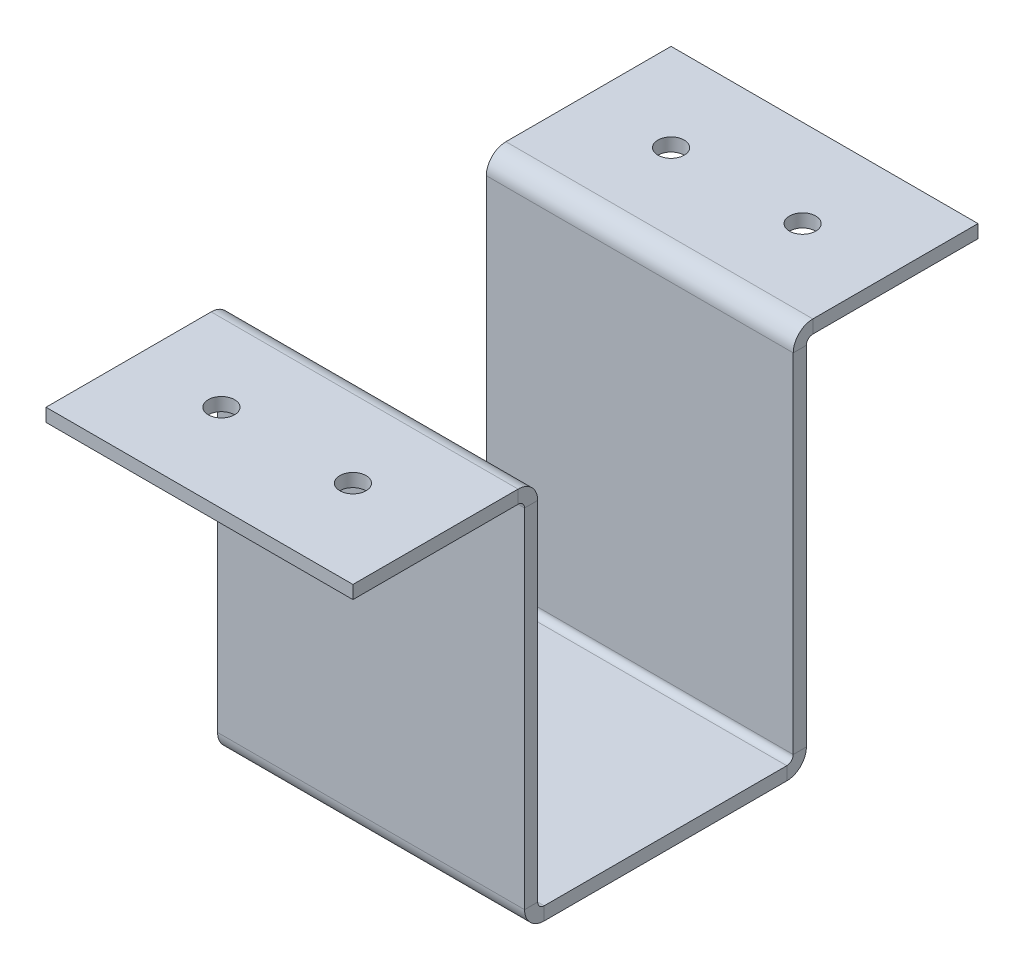
ISO-10303-21;
HEADER;
FILE_DESCRIPTION(('STEP AP214'),'2;1');
FILE_NAME('part.step','',(''),(''),'','','');
FILE_SCHEMA(('AUTOMOTIVE_DESIGN { 1 0 10303 214 1 1 1 1 }'));
ENDSEC;
DATA;
#1=APPLICATION_CONTEXT('core data for automotive mechanical design processes');
#2=APPLICATION_PROTOCOL_DEFINITION('international standard','automotive_design',2000,#1);
#3=PRODUCT_CONTEXT('',#1,'mechanical');
#4=PRODUCT('Part','Part','',(#3));
#5=PRODUCT_RELATED_PRODUCT_CATEGORY('part','',(#4));
#6=PRODUCT_DEFINITION_FORMATION('','',#4);
#7=PRODUCT_DEFINITION_CONTEXT('part definition',#1,'design');
#8=PRODUCT_DEFINITION('design','',#6,#7);
#9=PRODUCT_DEFINITION_SHAPE('','',#8);
#10=(LENGTH_UNIT() NAMED_UNIT(*) SI_UNIT(.MILLI.,.METRE.));
#11=(NAMED_UNIT(*) PLANE_ANGLE_UNIT() SI_UNIT($,.RADIAN.));
#12=(NAMED_UNIT(*) SI_UNIT($,.STERADIAN.) SOLID_ANGLE_UNIT());
#13=UNCERTAINTY_MEASURE_WITH_UNIT(LENGTH_MEASURE(1.E-05),#10,'distance_accuracy_value','');
#14=(GEOMETRIC_REPRESENTATION_CONTEXT(3) GLOBAL_UNCERTAINTY_ASSIGNED_CONTEXT((#13)) GLOBAL_UNIT_ASSIGNED_CONTEXT((#10,
#11,#12)) REPRESENTATION_CONTEXT('',''));
#15=CARTESIAN_POINT('',(0.,0.,0.));
#16=DIRECTION('',(0.,0.,1.));
#17=DIRECTION('',(1.,0.,0.));
#18=AXIS2_PLACEMENT_3D('',#15,#16,#17);
#19=CARTESIAN_POINT('',(0.,21.0690270902934,18.9309729097066));
#20=DIRECTION('',(0.,-1.,0.));
#21=DIRECTION('',(-1.,0.,0.));
#22=AXIS2_PLACEMENT_3D('',#19,#20,#21);
#23=PLANE('',#22);
#24=DIRECTION('',(0.,0.,-1.));
#25=VECTOR('',#24,1.);
#26=CARTESIAN_POINT('',(35.,21.0690270902934,18.9309729097066));
#27=LINE('',#26,#25);
#28=CARTESIAN_POINT('',(35.,21.0690270902932,-44.2366));
#29=VERTEX_POINT('',#28);
#30=CARTESIAN_POINT('',(35.,21.0690270902931,-71.9014541805867));
#31=VERTEX_POINT('',#30);
#32=EDGE_CURVE('E74',#29,#31,#27,.T.);
#33=ORIENTED_EDGE('',*,*,#32,.T.);
#34=DIRECTION('',(-1.,0.,0.));
#35=VECTOR('',#34,1.);
#36=CARTESIAN_POINT('',(0.,21.0690270902931,-71.9014541805867));
#37=LINE('',#36,#35);
#38=CARTESIAN_POINT('',(0.,21.0690270902931,-71.9014541805867));
#39=VERTEX_POINT('',#38);
#40=EDGE_CURVE('E66',#31,#39,#37,.T.);
#41=ORIENTED_EDGE('',*,*,#40,.T.);
#42=DIRECTION('',(0.,0.,1.));
#43=VECTOR('',#42,1.);
#44=CARTESIAN_POINT('',(0.,21.0690270902934,18.9309729097066));
#45=LINE('',#44,#43);
#46=CARTESIAN_POINT('',(0.,21.0690270902932,-44.2366));
#47=VERTEX_POINT('',#46);
#48=EDGE_CURVE('E82',#39,#47,#45,.T.);
#49=ORIENTED_EDGE('',*,*,#48,.T.);
#50=DIRECTION('',(-1.,0.,0.));
#51=VECTOR('',#50,1.);
#52=CARTESIAN_POINT('',(0.,21.0690270902932,-44.2366));
#53=LINE('',#52,#51);
#54=EDGE_CURVE('E451',#29,#47,#53,.T.);
#55=ORIENTED_EDGE('',*,*,#54,.F.);
#56=EDGE_LOOP('',(#33,#41,#49,#55));
#57=FACE_BOUND('',#56,.T.);
#58=ADVANCED_FACE('F56',(#57),#23,.F.);
#59=CARTESIAN_POINT('',(0.,19.5690270902934,18.9309729097066));
#60=DIRECTION('',(0.,-1.,0.));
#61=DIRECTION('',(-1.,0.,0.));
#62=AXIS2_PLACEMENT_3D('',#59,#60,#61);
#63=PLANE('',#62);
#64=DIRECTION('',(-1.,0.,0.));
#65=VECTOR('',#64,1.);
#66=CARTESIAN_POINT('',(0.,19.5690270902931,-71.9014541805867));
#67=LINE('',#66,#65);
#68=CARTESIAN_POINT('',(35.,19.5690270902931,-71.9014541805867));
#69=VERTEX_POINT('',#68);
#70=CARTESIAN_POINT('',(0.,19.5690270902931,-71.9014541805867));
#71=VERTEX_POINT('',#70);
#72=EDGE_CURVE('E457',#69,#71,#67,.T.);
#73=ORIENTED_EDGE('',*,*,#72,.F.);
#74=DIRECTION('',(0.,0.,-1.));
#75=VECTOR('',#74,1.);
#76=CARTESIAN_POINT('',(35.,19.5690270902934,18.9309729097067));
#77=LINE('',#76,#75);
#78=CARTESIAN_POINT('',(35.,19.5690270902932,-44.2366));
#79=VERTEX_POINT('',#78);
#80=EDGE_CURVE('E447',#79,#69,#77,.T.);
#81=ORIENTED_EDGE('',*,*,#80,.F.);
#82=DIRECTION('',(-1.,0.,0.));
#83=VECTOR('',#82,1.);
#84=CARTESIAN_POINT('',(0.,19.5690270902932,-44.2366));
#85=LINE('',#84,#83);
#86=CARTESIAN_POINT('',(0.,19.5690270902932,-44.2366));
#87=VERTEX_POINT('',#86);
#88=EDGE_CURVE('E442',#79,#87,#85,.T.);
#89=ORIENTED_EDGE('',*,*,#88,.T.);
#90=DIRECTION('',(0.,0.,1.));
#91=VECTOR('',#90,1.);
#92=CARTESIAN_POINT('',(0.,19.5690270902934,18.9309729097066));
#93=LINE('',#92,#91);
#94=EDGE_CURVE('E60',#71,#87,#93,.T.);
#95=ORIENTED_EDGE('',*,*,#94,.F.);
#96=EDGE_LOOP('',(#73,#81,#89,#95));
#97=FACE_BOUND('',#96,.T.);
#98=ADVANCED_FACE('F480',(#97),#63,.T.);
#99=CARTESIAN_POINT('',(35.,19.5690270902934,18.9309729097067));
#100=DIRECTION('',(1.,0.,0.));
#101=DIRECTION('',(0.,-1.,0.));
#102=AXIS2_PLACEMENT_3D('',#99,#100,#101);
#103=PLANE('',#102);
#104=DIRECTION('',(0.,-1.,0.));
#105=VECTOR('',#104,1.);
#106=CARTESIAN_POINT('',(35.,19.5690270902931,-71.9014541805867));
#107=LINE('',#106,#105);
#108=EDGE_CURVE('E12',#31,#69,#107,.T.);
#109=ORIENTED_EDGE('',*,*,#108,.F.);
#110=ORIENTED_EDGE('',*,*,#32,.F.);
#111=DIRECTION('',(0.,-1.,0.));
#112=VECTOR('',#111,1.);
#113=CARTESIAN_POINT('',(35.,19.5690270902932,-44.2366));
#114=LINE('',#113,#112);
#115=EDGE_CURVE('E446',#29,#79,#114,.T.);
#116=ORIENTED_EDGE('',*,*,#115,.T.);
#117=ORIENTED_EDGE('',*,*,#80,.T.);
#118=EDGE_LOOP('',(#109,#110,#116,#117));
#119=FACE_BOUND('',#118,.T.);
#120=ADVANCED_FACE('F58',(#119),#103,.T.);
#121=CARTESIAN_POINT('',(0.,19.5690270902934,18.9309729097066));
#122=DIRECTION('',(-1.,0.,0.));
#123=DIRECTION('',(0.,1.,0.));
#124=AXIS2_PLACEMENT_3D('',#121,#122,#123);
#125=PLANE('',#124);
#126=DIRECTION('',(0.,1.,0.));
#127=VECTOR('',#126,1.);
#128=CARTESIAN_POINT('',(0.,19.5690270902931,-71.9014541805867));
#129=LINE('',#128,#127);
#130=EDGE_CURVE('E461',#71,#39,#129,.T.);
#131=ORIENTED_EDGE('',*,*,#130,.F.);
#132=ORIENTED_EDGE('',*,*,#94,.T.);
#133=DIRECTION('',(0.,1.,0.));
#134=VECTOR('',#133,1.);
#135=CARTESIAN_POINT('',(0.,19.5690270902932,-44.2366));
#136=LINE('',#135,#134);
#137=EDGE_CURVE('E454',#87,#47,#136,.T.);
#138=ORIENTED_EDGE('',*,*,#137,.T.);
#139=ORIENTED_EDGE('',*,*,#48,.F.);
#140=EDGE_LOOP('',(#131,#132,#138,#139));
#141=FACE_BOUND('',#140,.T.);
#142=ADVANCED_FACE('F475',(#141),#125,.T.);
#143=CARTESIAN_POINT('',(35.,21.8056270902932,-44.2366));
#144=DIRECTION('',(1.,0.,0.));
#145=DIRECTION('',(0.,0.,-1.));
#146=AXIS2_PLACEMENT_3D('',#143,#144,#145);
#147=PLANE('',#146);
#148=ORIENTED_EDGE('',*,*,#115,.F.);
#149=CARTESIAN_POINT('',(35.,21.8056270902932,-44.2366));
#150=DIRECTION('',(-1.,0.,0.));
#151=DIRECTION('',(0.,-1.,0.));
#152=AXIS2_PLACEMENT_3D('',#149,#150,#151);
#153=CIRCLE('',#152,0.7366);
#154=CARTESIAN_POINT('',(35.,21.8056270902932,-43.5));
#155=VERTEX_POINT('',#154);
#156=EDGE_CURVE('E325',#29,#155,#153,.T.);
#157=ORIENTED_EDGE('',*,*,#156,.T.);
#158=DIRECTION('',(0.,0.,1.));
#159=VECTOR('',#158,1.);
#160=CARTESIAN_POINT('',(35.,21.8056270902932,-42.));
#161=LINE('',#160,#159);
#162=CARTESIAN_POINT('',(35.,21.8056270902932,-42.));
#163=VERTEX_POINT('',#162);
#164=EDGE_CURVE('E416',#155,#163,#161,.T.);
#165=ORIENTED_EDGE('',*,*,#164,.T.);
#166=CARTESIAN_POINT('',(35.,21.8056270902932,-44.2366));
#167=DIRECTION('',(-1.,0.,0.));
#168=DIRECTION('',(0.,0.,-1.));
#169=AXIS2_PLACEMENT_3D('',#166,#167,#168);
#170=CIRCLE('',#169,2.2366);
#171=EDGE_CURVE('E427',#79,#163,#170,.T.);
#172=ORIENTED_EDGE('',*,*,#171,.F.);
#173=EDGE_LOOP('',(#148,#157,#165,#172));
#174=FACE_BOUND('',#173,.T.);
#175=ADVANCED_FACE('F528',(#174),#147,.T.);
#176=CARTESIAN_POINT('',(0.,21.8056270902932,-44.2366));
#177=DIRECTION('',(-1.,0.,0.));
#178=DIRECTION('',(0.,-1.,0.));
#179=AXIS2_PLACEMENT_3D('',#176,#177,#178);
#180=PLANE('',#179);
#181=DIRECTION('',(0.,0.,-1.));
#182=VECTOR('',#181,1.);
#183=CARTESIAN_POINT('',(0.,21.8056270902932,-42.));
#184=LINE('',#183,#182);
#185=CARTESIAN_POINT('',(0.,21.8056270902932,-42.));
#186=VERTEX_POINT('',#185);
#187=CARTESIAN_POINT('',(0.,21.8056270902932,-43.5));
#188=VERTEX_POINT('',#187);
#189=EDGE_CURVE('E420',#186,#188,#184,.T.);
#190=ORIENTED_EDGE('',*,*,#189,.T.);
#191=CARTESIAN_POINT('',(0.,21.8056270902932,-44.2366));
#192=DIRECTION('',(-1.,0.,0.));
#193=DIRECTION('',(0.,-1.,0.));
#194=AXIS2_PLACEMENT_3D('',#191,#192,#193);
#195=CIRCLE('',#194,0.7366);
#196=EDGE_CURVE('E432',#188,#47,#195,.F.);
#197=ORIENTED_EDGE('',*,*,#196,.T.);
#198=ORIENTED_EDGE('',*,*,#137,.F.);
#199=CARTESIAN_POINT('',(0.,21.8056270902932,-44.2366));
#200=DIRECTION('',(1.,0.,0.));
#201=DIRECTION('',(0.,-1.,0.));
#202=AXIS2_PLACEMENT_3D('',#199,#200,#201);
#203=CIRCLE('',#202,2.2366);
#204=EDGE_CURVE('E431',#186,#87,#203,.T.);
#205=ORIENTED_EDGE('',*,*,#204,.F.);
#206=EDGE_LOOP('',(#190,#197,#198,#205));
#207=FACE_BOUND('',#206,.T.);
#208=ADVANCED_FACE('F485',(#207),#180,.T.);
#209=CARTESIAN_POINT('',(52.6098690683677,21.8056270902932,-44.2366));
#210=DIRECTION('',(-1.,0.,0.));
#211=DIRECTION('',(0.,-1.,0.));
#212=AXIS2_PLACEMENT_3D('',#209,#210,#211);
#213=CYLINDRICAL_SURFACE('',#212,2.2366);
#214=ORIENTED_EDGE('',*,*,#204,.T.);
#215=ORIENTED_EDGE('',*,*,#88,.F.);
#216=ORIENTED_EDGE('',*,*,#171,.T.);
#217=DIRECTION('',(-1.,0.,0.));
#218=VECTOR('',#217,1.);
#219=CARTESIAN_POINT('',(0.,21.8056270902932,-42.));
#220=LINE('',#219,#218);
#221=EDGE_CURVE('E315',#163,#186,#220,.T.);
#222=ORIENTED_EDGE('',*,*,#221,.T.);
#223=EDGE_LOOP('',(#214,#215,#216,#222));
#224=FACE_BOUND('',#223,.T.);
#225=ADVANCED_FACE('F482',(#224),#213,.T.);
#226=CARTESIAN_POINT('',(52.6098690683677,21.8056270902932,-44.2366));
#227=DIRECTION('',(-1.,0.,0.));
#228=DIRECTION('',(0.,-1.,0.));
#229=AXIS2_PLACEMENT_3D('',#226,#227,#228);
#230=CYLINDRICAL_SURFACE('',#229,0.7366);
#231=ORIENTED_EDGE('',*,*,#196,.F.);
#232=DIRECTION('',(-1.,0.,0.));
#233=VECTOR('',#232,1.);
#234=CARTESIAN_POINT('',(0.,21.8056270902932,-43.5));
#235=LINE('',#234,#233);
#236=EDGE_CURVE('E333',#155,#188,#235,.T.);
#237=ORIENTED_EDGE('',*,*,#236,.F.);
#238=ORIENTED_EDGE('',*,*,#156,.F.);
#239=ORIENTED_EDGE('',*,*,#54,.T.);
#240=EDGE_LOOP('',(#231,#237,#238,#239));
#241=FACE_BOUND('',#240,.T.);
#242=ADVANCED_FACE('F529',(#241),#230,.F.);
#243=CARTESIAN_POINT('',(0.,62.20708127088,-22.430972909707));
#244=DIRECTION('',(0.,0.,1.));
#245=DIRECTION('',(0.,-1.,0.));
#246=AXIS2_PLACEMENT_3D('',#243,#244,#245);
#247=PLANE('',#246);
#248=DIRECTION('',(1.,0.,0.));
#249=VECTOR('',#248,1.);
#250=CARTESIAN_POINT('',(0.,63.70708127088,-22.430972909707));
#251=LINE('',#250,#249);
#252=CARTESIAN_POINT('',(0.,63.70708127088,-22.430972909707));
#253=VERTEX_POINT('',#252);
#254=CARTESIAN_POINT('',(35.,63.70708127088,-22.4309729097069));
#255=VERTEX_POINT('',#254);
#256=EDGE_CURVE('E391',#253,#255,#251,.T.);
#257=ORIENTED_EDGE('',*,*,#256,.F.);
#258=DIRECTION('',(0.,1.,0.));
#259=VECTOR('',#258,1.);
#260=CARTESIAN_POINT('',(0.,62.20708127088,-22.430972909707));
#261=LINE('',#260,#259);
#262=CARTESIAN_POINT('',(0.,62.20708127088,-22.430972909707));
#263=VERTEX_POINT('',#262);
#264=EDGE_CURVE('E398',#263,#253,#261,.T.);
#265=ORIENTED_EDGE('',*,*,#264,.F.);
#266=DIRECTION('',(1.,0.,0.));
#267=VECTOR('',#266,1.);
#268=CARTESIAN_POINT('',(0.,62.20708127088,-22.430972909707));
#269=LINE('',#268,#267);
#270=CARTESIAN_POINT('',(35.,62.20708127088,-22.4309729097069));
#271=VERTEX_POINT('',#270);
#272=EDGE_CURVE('E412',#263,#271,#269,.T.);
#273=ORIENTED_EDGE('',*,*,#272,.T.);
#274=DIRECTION('',(0.,1.,0.));
#275=VECTOR('',#274,1.);
#276=CARTESIAN_POINT('',(35.,62.20708127088,-22.4309729097069));
#277=LINE('',#276,#275);
#278=EDGE_CURVE('E409',#271,#255,#277,.T.);
#279=ORIENTED_EDGE('',*,*,#278,.T.);
#280=EDGE_LOOP('',(#257,#265,#273,#279));
#281=FACE_BOUND('',#280,.T.);
#282=ADVANCED_FACE('F560',(#281),#247,.T.);
#283=CARTESIAN_POINT('',(0.,62.20708127088,-22.430972909707));
#284=DIRECTION('',(-1.,0.,0.));
#285=DIRECTION('',(0.,1.,0.));
#286=AXIS2_PLACEMENT_3D('',#283,#284,#285);
#287=PLANE('',#286);
#288=DIRECTION('',(0.,0.,1.));
#289=VECTOR('',#288,1.);
#290=CARTESIAN_POINT('',(0.,63.70708127088,-22.430972909707));
#291=LINE('',#290,#289);
#292=CARTESIAN_POINT('',(0.,63.7070812708799,-41.2634000000003));
#293=VERTEX_POINT('',#292);
#294=EDGE_CURVE('E395',#293,#253,#291,.T.);
#295=ORIENTED_EDGE('',*,*,#294,.F.);
#296=DIRECTION('',(0.,-1.,0.));
#297=VECTOR('',#296,1.);
#298=CARTESIAN_POINT('',(0.,62.2070812708801,-41.2634000000003));
#299=LINE('',#298,#297);
#300=CARTESIAN_POINT('',(0.,62.2070812708799,-41.2634000000003));
#301=VERTEX_POINT('',#300);
#302=EDGE_CURVE('E405',#293,#301,#299,.T.);
#303=ORIENTED_EDGE('',*,*,#302,.T.);
#304=DIRECTION('',(0.,0.,1.));
#305=VECTOR('',#304,1.);
#306=CARTESIAN_POINT('',(0.,62.20708127088,-22.430972909707));
#307=LINE('',#306,#305);
#308=EDGE_CURVE('E402',#301,#263,#307,.T.);
#309=ORIENTED_EDGE('',*,*,#308,.T.);
#310=ORIENTED_EDGE('',*,*,#264,.T.);
#311=EDGE_LOOP('',(#295,#303,#309,#310));
#312=FACE_BOUND('',#311,.T.);
#313=ADVANCED_FACE('F563',(#312),#287,.T.);
#314=CARTESIAN_POINT('',(0.,63.70708127088,-22.430972909707));
#315=DIRECTION('',(0.,-1.,0.));
#316=DIRECTION('',(-1.,0.,0.));
#317=AXIS2_PLACEMENT_3D('',#314,#315,#316);
#318=PLANE('',#317);
#319=CARTESIAN_POINT('',(10.,63.70708127088,-32.430972909707));
#320=DIRECTION('',(0.,-1.,0.));
#321=DIRECTION('',(0.,0.,-1.));
#322=AXIS2_PLACEMENT_3D('',#319,#320,#321);
#323=CIRCLE('',#322,1.5);
#324=CARTESIAN_POINT('',(10.,63.70708127088,-33.930972909707));
#325=VERTEX_POINT('',#324);
#326=EDGE_CURVE('E652',#325,#325,#323,.T.);
#327=ORIENTED_EDGE('',*,*,#326,.T.);
#328=EDGE_LOOP('',(#327));
#329=FACE_BOUND('',#328,.T.);
#330=CARTESIAN_POINT('',(25.,63.70708127088,-32.430972909707));
#331=DIRECTION('',(0.,-1.,0.));
#332=DIRECTION('',(0.,0.,-1.));
#333=AXIS2_PLACEMENT_3D('',#330,#331,#332);
#334=CIRCLE('',#333,1.5);
#335=CARTESIAN_POINT('',(25.,63.70708127088,-33.930972909707));
#336=VERTEX_POINT('',#335);
#337=EDGE_CURVE('E630',#336,#336,#334,.T.);
#338=ORIENTED_EDGE('',*,*,#337,.T.);
#339=EDGE_LOOP('',(#338));
#340=FACE_BOUND('',#339,.T.);
#341=DIRECTION('',(1.,0.,0.));
#342=VECTOR('',#341,1.);
#343=CARTESIAN_POINT('',(0.,63.7070812708799,-41.2634000000003));
#344=LINE('',#343,#342);
#345=CARTESIAN_POINT('',(35.,63.7070812708799,-41.2634000000003));
#346=VERTEX_POINT('',#345);
#347=EDGE_CURVE('E363',#293,#346,#344,.T.);
#348=ORIENTED_EDGE('',*,*,#347,.F.);
#349=ORIENTED_EDGE('',*,*,#294,.T.);
#350=ORIENTED_EDGE('',*,*,#256,.T.);
#351=DIRECTION('',(0.,0.,-1.));
#352=VECTOR('',#351,1.);
#353=CARTESIAN_POINT('',(35.,63.70708127088,-22.4309729097069));
#354=LINE('',#353,#352);
#355=EDGE_CURVE('E387',#255,#346,#354,.T.);
#356=ORIENTED_EDGE('',*,*,#355,.T.);
#357=EDGE_LOOP('',(#348,#349,#350,#356));
#358=FACE_BOUND('',#357,.T.);
#359=ADVANCED_FACE('F571',(#329,#340,#358),#318,.F.);
#360=CARTESIAN_POINT('',(35.,62.20708127088,-22.4309729097069));
#361=DIRECTION('',(1.,0.,0.));
#362=DIRECTION('',(0.,-1.,0.));
#363=AXIS2_PLACEMENT_3D('',#360,#361,#362);
#364=PLANE('',#363);
#365=DIRECTION('',(0.,0.,-1.));
#366=VECTOR('',#365,1.);
#367=CARTESIAN_POINT('',(35.,62.20708127088,-22.4309729097069));
#368=LINE('',#367,#366);
#369=CARTESIAN_POINT('',(35.,62.2070812708799,-41.2634000000003));
#370=VERTEX_POINT('',#369);
#371=EDGE_CURVE('E383',#271,#370,#368,.T.);
#372=ORIENTED_EDGE('',*,*,#371,.T.);
#373=DIRECTION('',(0.,1.,0.));
#374=VECTOR('',#373,1.);
#375=CARTESIAN_POINT('',(35.,62.2070812708801,-41.2634000000003));
#376=LINE('',#375,#374);
#377=EDGE_CURVE('E379',#370,#346,#376,.T.);
#378=ORIENTED_EDGE('',*,*,#377,.T.);
#379=ORIENTED_EDGE('',*,*,#355,.F.);
#380=ORIENTED_EDGE('',*,*,#278,.F.);
#381=EDGE_LOOP('',(#372,#378,#379,#380));
#382=FACE_BOUND('',#381,.T.);
#383=ADVANCED_FACE('F551',(#382),#364,.T.);
#384=CARTESIAN_POINT('',(0.,62.20708127088,-22.430972909707));
#385=DIRECTION('',(0.,-1.,0.));
#386=DIRECTION('',(-1.,0.,0.));
#387=AXIS2_PLACEMENT_3D('',#384,#385,#386);
#388=PLANE('',#387);
#389=CARTESIAN_POINT('',(10.,62.20708127088,-32.430972909707));
#390=DIRECTION('',(0.,-1.,0.));
#391=DIRECTION('',(0.,0.,-1.));
#392=AXIS2_PLACEMENT_3D('',#389,#390,#391);
#393=CIRCLE('',#392,1.5);
#394=CARTESIAN_POINT('',(10.,62.20708127088,-33.930972909707));
#395=VERTEX_POINT('',#394);
#396=EDGE_CURVE('E624',#395,#395,#393,.T.);
#397=ORIENTED_EDGE('',*,*,#396,.F.);
#398=EDGE_LOOP('',(#397));
#399=FACE_BOUND('',#398,.T.);
#400=CARTESIAN_POINT('',(25.,62.20708127088,-32.430972909707));
#401=DIRECTION('',(0.,-1.,0.));
#402=DIRECTION('',(0.,0.,-1.));
#403=AXIS2_PLACEMENT_3D('',#400,#401,#402);
#404=CIRCLE('',#403,1.5);
#405=CARTESIAN_POINT('',(25.,62.20708127088,-33.930972909707));
#406=VERTEX_POINT('',#405);
#407=EDGE_CURVE('E627',#406,#406,#404,.T.);
#408=ORIENTED_EDGE('',*,*,#407,.F.);
#409=EDGE_LOOP('',(#408));
#410=FACE_BOUND('',#409,.T.);
#411=ORIENTED_EDGE('',*,*,#308,.F.);
#412=DIRECTION('',(1.,0.,0.));
#413=VECTOR('',#412,1.);
#414=CARTESIAN_POINT('',(0.,62.2070812708799,-41.2634000000003));
#415=LINE('',#414,#413);
#416=EDGE_CURVE('E375',#301,#370,#415,.T.);
#417=ORIENTED_EDGE('',*,*,#416,.T.);
#418=ORIENTED_EDGE('',*,*,#371,.F.);
#419=ORIENTED_EDGE('',*,*,#272,.F.);
#420=EDGE_LOOP('',(#411,#417,#418,#419));
#421=FACE_BOUND('',#420,.T.);
#422=ADVANCED_FACE('F556',(#399,#410,#421),#388,.T.);
#423=CARTESIAN_POINT('',(0.,61.4704812708799,-41.2634000000003));
#424=DIRECTION('',(1.,0.,0.));
#425=DIRECTION('',(0.,0.,-1.));
#426=AXIS2_PLACEMENT_3D('',#423,#424,#425);
#427=PLANE('',#426);
#428=ORIENTED_EDGE('',*,*,#302,.F.);
#429=CARTESIAN_POINT('',(0.,61.4704812708799,-41.2634000000003));
#430=DIRECTION('',(1.,0.,0.));
#431=DIRECTION('',(0.,0.,-1.));
#432=AXIS2_PLACEMENT_3D('',#429,#430,#431);
#433=CIRCLE('',#432,2.2366);
#434=CARTESIAN_POINT('',(0.,61.4704812708799,-43.5000000000003));
#435=VERTEX_POINT('',#434);
#436=EDGE_CURVE('E371',#293,#435,#433,.F.);
#437=ORIENTED_EDGE('',*,*,#436,.T.);
#438=DIRECTION('',(0.,0.,1.));
#439=VECTOR('',#438,1.);
#440=CARTESIAN_POINT('',(0.,61.4704812708799,-42.0000000000005));
#441=LINE('',#440,#439);
#442=CARTESIAN_POINT('',(0.,61.4704812708799,-42.0000000000003));
#443=VERTEX_POINT('',#442);
#444=EDGE_CURVE('E367',#435,#443,#441,.T.);
#445=ORIENTED_EDGE('',*,*,#444,.T.);
#446=CARTESIAN_POINT('',(0.,61.4704812708799,-41.2634000000003));
#447=DIRECTION('',(-1.,0.,0.));
#448=DIRECTION('',(0.,0.,-1.));
#449=AXIS2_PLACEMENT_3D('',#446,#447,#448);
#450=CIRCLE('',#449,0.7366);
#451=EDGE_CURVE('E344',#301,#443,#450,.T.);
#452=ORIENTED_EDGE('',*,*,#451,.F.);
#453=EDGE_LOOP('',(#428,#437,#445,#452));
#454=FACE_BOUND('',#453,.T.);
#455=ADVANCED_FACE('F567',(#454),#427,.F.);
#456=CARTESIAN_POINT('',(-17.6098690683677,61.4704812708799,-41.2634000000003));
#457=DIRECTION('',(1.,0.,0.));
#458=DIRECTION('',(0.,0.,-1.));
#459=AXIS2_PLACEMENT_3D('',#456,#457,#458);
#460=CYLINDRICAL_SURFACE('',#459,2.2366);
#461=DIRECTION('',(1.,0.,0.));
#462=VECTOR('',#461,1.);
#463=CARTESIAN_POINT('',(0.,61.4704812708799,-43.5000000000003));
#464=LINE('',#463,#462);
#465=CARTESIAN_POINT('',(35.,61.4704812708799,-43.5000000000003));
#466=VERTEX_POINT('',#465);
#467=EDGE_CURVE('E326',#435,#466,#464,.T.);
#468=ORIENTED_EDGE('',*,*,#467,.F.);
#469=ORIENTED_EDGE('',*,*,#436,.F.);
#470=ORIENTED_EDGE('',*,*,#347,.T.);
#471=CARTESIAN_POINT('',(35.,61.4704812708799,-41.2634000000003));
#472=DIRECTION('',(1.,0.,0.));
#473=DIRECTION('',(0.,0.,-1.));
#474=AXIS2_PLACEMENT_3D('',#471,#472,#473);
#475=CIRCLE('',#474,2.2366);
#476=EDGE_CURVE('E360',#466,#346,#475,.T.);
#477=ORIENTED_EDGE('',*,*,#476,.F.);
#478=EDGE_LOOP('',(#468,#469,#470,#477));
#479=FACE_BOUND('',#478,.T.);
#480=ADVANCED_FACE('F569',(#479),#460,.T.);
#481=CARTESIAN_POINT('',(35.,61.4704812708799,-41.2634000000003));
#482=DIRECTION('',(-1.,0.,0.));
#483=DIRECTION('',(0.,1.,0.));
#484=AXIS2_PLACEMENT_3D('',#481,#482,#483);
#485=PLANE('',#484);
#486=ORIENTED_EDGE('',*,*,#476,.T.);
#487=ORIENTED_EDGE('',*,*,#377,.F.);
#488=CARTESIAN_POINT('',(35.,61.4704812708799,-41.2634000000003));
#489=DIRECTION('',(1.,0.,0.));
#490=DIRECTION('',(0.,1.,0.));
#491=AXIS2_PLACEMENT_3D('',#488,#489,#490);
#492=CIRCLE('',#491,0.736600000000002);
#493=CARTESIAN_POINT('',(35.,61.4704812708799,-42.0000000000003));
#494=VERTEX_POINT('',#493);
#495=EDGE_CURVE('E348',#494,#370,#492,.T.);
#496=ORIENTED_EDGE('',*,*,#495,.F.);
#497=DIRECTION('',(0.,0.,-1.));
#498=VECTOR('',#497,1.);
#499=CARTESIAN_POINT('',(35.,61.4704812708799,-42.0000000000004));
#500=LINE('',#499,#498);
#501=EDGE_CURVE('E356',#494,#466,#500,.T.);
#502=ORIENTED_EDGE('',*,*,#501,.T.);
#503=EDGE_LOOP('',(#486,#487,#496,#502));
#504=FACE_BOUND('',#503,.T.);
#505=ADVANCED_FACE('F547',(#504),#485,.F.);
#506=CARTESIAN_POINT('',(-17.6098690683677,61.4704812708799,-41.2634000000003));
#507=DIRECTION('',(1.,0.,0.));
#508=DIRECTION('',(0.,0.,-1.));
#509=AXIS2_PLACEMENT_3D('',#506,#507,#508);
#510=CYLINDRICAL_SURFACE('',#509,0.7366);
#511=DIRECTION('',(1.,0.,0.));
#512=VECTOR('',#511,1.);
#513=CARTESIAN_POINT('',(0.,61.4704812708799,-42.0000000000003));
#514=LINE('',#513,#512);
#515=EDGE_CURVE('E352',#443,#494,#514,.T.);
#516=ORIENTED_EDGE('',*,*,#515,.T.);
#517=ORIENTED_EDGE('',*,*,#495,.T.);
#518=ORIENTED_EDGE('',*,*,#416,.F.);
#519=ORIENTED_EDGE('',*,*,#451,.T.);
#520=EDGE_LOOP('',(#516,#517,#518,#519));
#521=FACE_BOUND('',#520,.T.);
#522=ADVANCED_FACE('F544',(#521),#510,.F.);
#523=CARTESIAN_POINT('',(0.,82.6380541805866,-42.0000000000004));
#524=DIRECTION('',(0.,0.,1.));
#525=DIRECTION('',(-1.,0.,0.));
#526=AXIS2_PLACEMENT_3D('',#523,#524,#525);
#527=PLANE('',#526);
#528=ORIENTED_EDGE('',*,*,#221,.F.);
#529=DIRECTION('',(0.,-1.,0.));
#530=VECTOR('',#529,1.);
#531=CARTESIAN_POINT('',(35.,82.6380541805866,-42.0000000000004));
#532=LINE('',#531,#530);
#533=EDGE_CURVE('E340',#494,#163,#532,.T.);
#534=ORIENTED_EDGE('',*,*,#533,.F.);
#535=ORIENTED_EDGE('',*,*,#515,.F.);
#536=DIRECTION('',(0.,1.,0.));
#537=VECTOR('',#536,1.);
#538=CARTESIAN_POINT('',(0.,82.6380541805866,-42.0000000000004));
#539=LINE('',#538,#537);
#540=EDGE_CURVE('E322',#186,#443,#539,.T.);
#541=ORIENTED_EDGE('',*,*,#540,.F.);
#542=EDGE_LOOP('',(#528,#534,#535,#541));
#543=FACE_BOUND('',#542,.T.);
#544=ADVANCED_FACE('F540',(#543),#527,.T.);
#545=CARTESIAN_POINT('',(35.,82.6380541805866,-42.0000000000004));
#546=DIRECTION('',(1.,0.,0.));
#547=DIRECTION('',(0.,0.,1.));
#548=AXIS2_PLACEMENT_3D('',#545,#546,#547);
#549=PLANE('',#548);
#550=ORIENTED_EDGE('',*,*,#164,.F.);
#551=DIRECTION('',(0.,-1.,0.));
#552=VECTOR('',#551,1.);
#553=CARTESIAN_POINT('',(35.,82.6380541805866,-43.5000000000004));
#554=LINE('',#553,#552);
#555=EDGE_CURVE('E337',#466,#155,#554,.T.);
#556=ORIENTED_EDGE('',*,*,#555,.F.);
#557=ORIENTED_EDGE('',*,*,#501,.F.);
#558=ORIENTED_EDGE('',*,*,#533,.T.);
#559=EDGE_LOOP('',(#550,#556,#557,#558));
#560=FACE_BOUND('',#559,.T.);
#561=ADVANCED_FACE('F536',(#560),#549,.T.);
#562=CARTESIAN_POINT('',(0.,82.6380541805866,-43.5000000000004));
#563=DIRECTION('',(0.,0.,1.));
#564=DIRECTION('',(-1.,0.,0.));
#565=AXIS2_PLACEMENT_3D('',#562,#563,#564);
#566=PLANE('',#565);
#567=ORIENTED_EDGE('',*,*,#555,.T.);
#568=ORIENTED_EDGE('',*,*,#236,.T.);
#569=DIRECTION('',(0.,1.,0.));
#570=VECTOR('',#569,1.);
#571=CARTESIAN_POINT('',(0.,82.6380541805866,-43.5000000000004));
#572=LINE('',#571,#570);
#573=EDGE_CURVE('E330',#188,#435,#572,.T.);
#574=ORIENTED_EDGE('',*,*,#573,.T.);
#575=ORIENTED_EDGE('',*,*,#467,.T.);
#576=EDGE_LOOP('',(#567,#568,#574,#575));
#577=FACE_BOUND('',#576,.T.);
#578=ADVANCED_FACE('F531',(#577),#566,.F.);
#579=CARTESIAN_POINT('',(0.,82.6380541805866,-42.0000000000004));
#580=DIRECTION('',(-1.,0.,0.));
#581=DIRECTION('',(0.,0.,-1.));
#582=AXIS2_PLACEMENT_3D('',#579,#580,#581);
#583=PLANE('',#582);
#584=ORIENTED_EDGE('',*,*,#189,.F.);
#585=ORIENTED_EDGE('',*,*,#540,.T.);
#586=ORIENTED_EDGE('',*,*,#444,.F.);
#587=ORIENTED_EDGE('',*,*,#573,.F.);
#588=EDGE_LOOP('',(#584,#585,#586,#587));
#589=FACE_BOUND('',#588,.T.);
#590=ADVANCED_FACE('F599',(#589),#583,.T.);
#591=CARTESIAN_POINT('',(35.,21.8056270902931,-71.9014541805868));
#592=DIRECTION('',(1.,0.,0.));
#593=DIRECTION('',(0.,0.,-1.));
#594=AXIS2_PLACEMENT_3D('',#591,#592,#593);
#595=PLANE('',#594);
#596=DIRECTION('',(0.,0.,-1.));
#597=VECTOR('',#596,1.);
#598=CARTESIAN_POINT('',(35.,21.8056270902931,-74.1380541805868));
#599=LINE('',#598,#597);
#600=CARTESIAN_POINT('',(35.,21.8056270902931,-72.6380541805868));
#601=VERTEX_POINT('',#600);
#602=CARTESIAN_POINT('',(35.,21.8056270902931,-74.1380541805868));
#603=VERTEX_POINT('',#602);
#604=EDGE_CURVE('E204',#601,#603,#599,.T.);
#605=ORIENTED_EDGE('',*,*,#604,.F.);
#606=CARTESIAN_POINT('',(35.,21.8056270902931,-71.9014541805868));
#607=DIRECTION('',(1.,0.,0.));
#608=DIRECTION('',(0.,1.,0.));
#609=AXIS2_PLACEMENT_3D('',#606,#607,#608);
#610=CIRCLE('',#609,0.7366);
#611=EDGE_CURVE('E221',#601,#31,#610,.F.);
#612=ORIENTED_EDGE('',*,*,#611,.T.);
#613=ORIENTED_EDGE('',*,*,#108,.T.);
#614=CARTESIAN_POINT('',(35.,21.8056270902931,-71.9014541805868));
#615=DIRECTION('',(-1.,0.,0.));
#616=DIRECTION('',(0.,0.,-1.));
#617=AXIS2_PLACEMENT_3D('',#614,#615,#616);
#618=CIRCLE('',#617,2.2366);
#619=EDGE_CURVE('E306',#603,#69,#618,.T.);
#620=ORIENTED_EDGE('',*,*,#619,.F.);
#621=EDGE_LOOP('',(#605,#612,#613,#620));
#622=FACE_BOUND('',#621,.T.);
#623=ADVANCED_FACE('F508',(#622),#595,.T.);
#624=CARTESIAN_POINT('',(0.,21.8056270902931,-71.9014541805868));
#625=DIRECTION('',(-1.,0.,0.));
#626=DIRECTION('',(0.,-1.,0.));
#627=AXIS2_PLACEMENT_3D('',#624,#625,#626);
#628=PLANE('',#627);
#629=CARTESIAN_POINT('',(0.,21.8056270902931,-71.9014541805868));
#630=DIRECTION('',(1.,0.,0.));
#631=DIRECTION('',(0.,1.,0.));
#632=AXIS2_PLACEMENT_3D('',#629,#630,#631);
#633=CIRCLE('',#632,0.7366);
#634=CARTESIAN_POINT('',(0.,21.8056270902931,-72.6380541805868));
#635=VERTEX_POINT('',#634);
#636=EDGE_CURVE('E311',#39,#635,#633,.T.);
#637=ORIENTED_EDGE('',*,*,#636,.T.);
#638=DIRECTION('',(0.,0.,1.));
#639=VECTOR('',#638,1.);
#640=CARTESIAN_POINT('',(0.,21.8056270902931,-74.1380541805868));
#641=LINE('',#640,#639);
#642=CARTESIAN_POINT('',(0.,21.8056270902931,-74.1380541805868));
#643=VERTEX_POINT('',#642);
#644=EDGE_CURVE('E244',#643,#635,#641,.T.);
#645=ORIENTED_EDGE('',*,*,#644,.F.);
#646=CARTESIAN_POINT('',(0.,21.8056270902931,-71.9014541805868));
#647=DIRECTION('',(1.,0.,0.));
#648=DIRECTION('',(0.,-1.,0.));
#649=AXIS2_PLACEMENT_3D('',#646,#647,#648);
#650=CIRCLE('',#649,2.2366);
#651=EDGE_CURVE('E310',#71,#643,#650,.T.);
#652=ORIENTED_EDGE('',*,*,#651,.F.);
#653=ORIENTED_EDGE('',*,*,#130,.T.);
#654=EDGE_LOOP('',(#637,#645,#652,#653));
#655=FACE_BOUND('',#654,.T.);
#656=ADVANCED_FACE('F495',(#655),#628,.T.);
#657=CARTESIAN_POINT('',(-17.6098690683677,21.8056270902931,-71.9014541805868));
#658=DIRECTION('',(1.,0.,0.));
#659=DIRECTION('',(0.,1.,0.));
#660=AXIS2_PLACEMENT_3D('',#657,#658,#659);
#661=CYLINDRICAL_SURFACE('',#660,2.2366);
#662=ORIENTED_EDGE('',*,*,#72,.T.);
#663=ORIENTED_EDGE('',*,*,#651,.T.);
#664=DIRECTION('',(-1.,0.,0.));
#665=VECTOR('',#664,1.);
#666=CARTESIAN_POINT('',(0.,21.8056270902931,-74.1380541805868));
#667=LINE('',#666,#665);
#668=EDGE_CURVE('E239',#603,#643,#667,.T.);
#669=ORIENTED_EDGE('',*,*,#668,.F.);
#670=ORIENTED_EDGE('',*,*,#619,.T.);
#671=EDGE_LOOP('',(#662,#663,#669,#670));
#672=FACE_BOUND('',#671,.T.);
#673=ADVANCED_FACE('F524',(#672),#661,.T.);
#674=CARTESIAN_POINT('',(-17.6098690683677,21.8056270902931,-71.9014541805868));
#675=DIRECTION('',(1.,0.,0.));
#676=DIRECTION('',(0.,1.,0.));
#677=AXIS2_PLACEMENT_3D('',#674,#675,#676);
#678=CYLINDRICAL_SURFACE('',#677,0.7366);
#679=ORIENTED_EDGE('',*,*,#40,.F.);
#680=ORIENTED_EDGE('',*,*,#611,.F.);
#681=DIRECTION('',(-1.,0.,0.));
#682=VECTOR('',#681,1.);
#683=CARTESIAN_POINT('',(0.,21.8056270902931,-72.6380541805868));
#684=LINE('',#683,#682);
#685=EDGE_CURVE('E301',#601,#635,#684,.T.);
#686=ORIENTED_EDGE('',*,*,#685,.T.);
#687=ORIENTED_EDGE('',*,*,#636,.F.);
#688=EDGE_LOOP('',(#679,#680,#686,#687));
#689=FACE_BOUND('',#688,.T.);
#690=ADVANCED_FACE('F497',(#689),#678,.F.);
#691=CARTESIAN_POINT('',(0.,62.2070812708797,-93.7070812708801));
#692=DIRECTION('',(0.,0.,-1.));
#693=DIRECTION('',(0.,1.,0.));
#694=AXIS2_PLACEMENT_3D('',#691,#692,#693);
#695=PLANE('',#694);
#696=DIRECTION('',(-1.,0.,0.));
#697=VECTOR('',#696,1.);
#698=CARTESIAN_POINT('',(0.,63.7070812708797,-93.7070812708801));
#699=LINE('',#698,#697);
#700=CARTESIAN_POINT('',(35.,63.7070812708797,-93.7070812708801));
#701=VERTEX_POINT('',#700);
#702=CARTESIAN_POINT('',(0.,63.7070812708797,-93.7070812708801));
#703=VERTEX_POINT('',#702);
#704=EDGE_CURVE('E273',#701,#703,#699,.T.);
#705=ORIENTED_EDGE('',*,*,#704,.F.);
#706=DIRECTION('',(0.,1.,0.));
#707=VECTOR('',#706,1.);
#708=CARTESIAN_POINT('',(35.,62.2070812708797,-93.7070812708801));
#709=LINE('',#708,#707);
#710=CARTESIAN_POINT('',(35.,62.2070812708797,-93.7070812708801));
#711=VERTEX_POINT('',#710);
#712=EDGE_CURVE('E287',#711,#701,#709,.T.);
#713=ORIENTED_EDGE('',*,*,#712,.F.);
#714=DIRECTION('',(-1.,0.,0.));
#715=VECTOR('',#714,1.);
#716=CARTESIAN_POINT('',(0.,62.2070812708797,-93.7070812708801));
#717=LINE('',#716,#715);
#718=CARTESIAN_POINT('',(0.,62.2070812708797,-93.7070812708801));
#719=VERTEX_POINT('',#718);
#720=EDGE_CURVE('E297',#711,#719,#717,.T.);
#721=ORIENTED_EDGE('',*,*,#720,.T.);
#722=DIRECTION('',(0.,1.,0.));
#723=VECTOR('',#722,1.);
#724=CARTESIAN_POINT('',(0.,62.2070812708797,-93.7070812708801));
#725=LINE('',#724,#723);
#726=EDGE_CURVE('E294',#719,#703,#725,.T.);
#727=ORIENTED_EDGE('',*,*,#726,.T.);
#728=EDGE_LOOP('',(#705,#713,#721,#727));
#729=FACE_BOUND('',#728,.T.);
#730=ADVANCED_FACE('F682',(#729),#695,.T.);
#731=CARTESIAN_POINT('',(35.,62.2070812708803,60.2929187291199));
#732=DIRECTION('',(1.,0.,0.));
#733=DIRECTION('',(0.,-1.,0.));
#734=AXIS2_PLACEMENT_3D('',#731,#732,#733);
#735=PLANE('',#734);
#736=DIRECTION('',(0.,1.,0.));
#737=VECTOR('',#736,1.);
#738=CARTESIAN_POINT('',(35.,62.2070812708807,-74.8746541805868));
#739=LINE('',#738,#737);
#740=CARTESIAN_POINT('',(35.,62.2070812708798,-74.8746541805868));
#741=VERTEX_POINT('',#740);
#742=CARTESIAN_POINT('',(35.,63.7070812708798,-74.8746541805868));
#743=VERTEX_POINT('',#742);
#744=EDGE_CURVE('E264',#741,#743,#739,.T.);
#745=ORIENTED_EDGE('',*,*,#744,.F.);
#746=DIRECTION('',(0.,0.,-1.));
#747=VECTOR('',#746,1.);
#748=CARTESIAN_POINT('',(35.,62.2070812708803,60.2929187291199));
#749=LINE('',#748,#747);
#750=EDGE_CURVE('E291',#741,#711,#749,.T.);
#751=ORIENTED_EDGE('',*,*,#750,.T.);
#752=ORIENTED_EDGE('',*,*,#712,.T.);
#753=DIRECTION('',(0.,0.,-1.));
#754=VECTOR('',#753,1.);
#755=CARTESIAN_POINT('',(35.,63.7070812708803,60.2929187291199));
#756=LINE('',#755,#754);
#757=EDGE_CURVE('E277',#743,#701,#756,.T.);
#758=ORIENTED_EDGE('',*,*,#757,.F.);
#759=EDGE_LOOP('',(#745,#751,#752,#758));
#760=FACE_BOUND('',#759,.T.);
#761=ADVANCED_FACE('F685',(#760),#735,.T.);
#762=CARTESIAN_POINT('',(0.,63.7070812708803,60.2929187291199));
#763=DIRECTION('',(0.,-1.,0.));
#764=DIRECTION('',(-1.,0.,0.));
#765=AXIS2_PLACEMENT_3D('',#762,#763,#764);
#766=PLANE('',#765);
#767=CARTESIAN_POINT('',(10.,63.7070812708798,-83.7070812708801));
#768=DIRECTION('',(0.,-1.,0.));
#769=DIRECTION('',(0.,0.,-1.));
#770=AXIS2_PLACEMENT_3D('',#767,#768,#769);
#771=CIRCLE('',#770,1.5);
#772=CARTESIAN_POINT('',(10.,63.7070812708798,-85.2070812708801));
#773=VERTEX_POINT('',#772);
#774=EDGE_CURVE('E305',#773,#773,#771,.T.);
#775=ORIENTED_EDGE('',*,*,#774,.T.);
#776=EDGE_LOOP('',(#775));
#777=FACE_BOUND('',#776,.T.);
#778=CARTESIAN_POINT('',(25.,63.7070812708798,-83.7070812708801));
#779=DIRECTION('',(0.,-1.,0.));
#780=DIRECTION('',(0.,0.,-1.));
#781=AXIS2_PLACEMENT_3D('',#778,#779,#780);
#782=CIRCLE('',#781,1.5);
#783=CARTESIAN_POINT('',(25.,63.7070812708798,-85.2070812708801));
#784=VERTEX_POINT('',#783);
#785=EDGE_CURVE('E645',#784,#784,#782,.T.);
#786=ORIENTED_EDGE('',*,*,#785,.T.);
#787=EDGE_LOOP('',(#786));
#788=FACE_BOUND('',#787,.T.);
#789=DIRECTION('',(0.,0.,1.));
#790=VECTOR('',#789,1.);
#791=CARTESIAN_POINT('',(0.,63.7070812708803,60.2929187291199));
#792=LINE('',#791,#790);
#793=CARTESIAN_POINT('',(0.,63.7070812708798,-74.8746541805868));
#794=VERTEX_POINT('',#793);
#795=EDGE_CURVE('E284',#703,#794,#792,.T.);
#796=ORIENTED_EDGE('',*,*,#795,.T.);
#797=DIRECTION('',(1.,0.,0.));
#798=VECTOR('',#797,1.);
#799=CARTESIAN_POINT('',(0.,63.7070812708798,-74.8746541805868));
#800=LINE('',#799,#798);
#801=EDGE_CURVE('E280',#794,#743,#800,.T.);
#802=ORIENTED_EDGE('',*,*,#801,.T.);
#803=ORIENTED_EDGE('',*,*,#757,.T.);
#804=ORIENTED_EDGE('',*,*,#704,.T.);
#805=EDGE_LOOP('',(#796,#802,#803,#804));
#806=FACE_BOUND('',#805,.T.);
#807=ADVANCED_FACE('F689',(#777,#788,#806),#766,.F.);
#808=CARTESIAN_POINT('',(0.,62.2070812708803,60.2929187291199));
#809=DIRECTION('',(-1.,0.,0.));
#810=DIRECTION('',(0.,1.,0.));
#811=AXIS2_PLACEMENT_3D('',#808,#809,#810);
#812=PLANE('',#811);
#813=DIRECTION('',(0.,-1.,0.));
#814=VECTOR('',#813,1.);
#815=CARTESIAN_POINT('',(0.,62.2070812708807,-74.8746541805868));
#816=LINE('',#815,#814);
#817=CARTESIAN_POINT('',(0.,62.2070812708798,-74.8746541805868));
#818=VERTEX_POINT('',#817);
#819=EDGE_CURVE('E253',#794,#818,#816,.T.);
#820=ORIENTED_EDGE('',*,*,#819,.F.);
#821=ORIENTED_EDGE('',*,*,#795,.F.);
#822=ORIENTED_EDGE('',*,*,#726,.F.);
#823=DIRECTION('',(0.,0.,1.));
#824=VECTOR('',#823,1.);
#825=CARTESIAN_POINT('',(0.,62.2070812708803,60.2929187291199));
#826=LINE('',#825,#824);
#827=EDGE_CURVE('E269',#719,#818,#826,.T.);
#828=ORIENTED_EDGE('',*,*,#827,.T.);
#829=EDGE_LOOP('',(#820,#821,#822,#828));
#830=FACE_BOUND('',#829,.T.);
#831=ADVANCED_FACE('F693',(#830),#812,.T.);
#832=CARTESIAN_POINT('',(0.,62.2070812708803,60.2929187291199));
#833=DIRECTION('',(0.,-1.,0.));
#834=DIRECTION('',(-1.,0.,0.));
#835=AXIS2_PLACEMENT_3D('',#832,#833,#834);
#836=PLANE('',#835);
#837=CARTESIAN_POINT('',(10.,62.2070812708798,-83.7070812708801));
#838=DIRECTION('',(0.,-1.,0.));
#839=DIRECTION('',(0.,0.,-1.));
#840=AXIS2_PLACEMENT_3D('',#837,#838,#839);
#841=CIRCLE('',#840,1.5);
#842=CARTESIAN_POINT('',(10.,62.2070812708798,-85.2070812708801));
#843=VERTEX_POINT('',#842);
#844=EDGE_CURVE('E641',#843,#843,#841,.T.);
#845=ORIENTED_EDGE('',*,*,#844,.F.);
#846=EDGE_LOOP('',(#845));
#847=FACE_BOUND('',#846,.T.);
#848=CARTESIAN_POINT('',(25.,62.2070812708798,-83.7070812708801));
#849=DIRECTION('',(0.,-1.,0.));
#850=DIRECTION('',(0.,0.,-1.));
#851=AXIS2_PLACEMENT_3D('',#848,#849,#850);
#852=CIRCLE('',#851,1.5);
#853=CARTESIAN_POINT('',(25.,62.2070812708798,-85.2070812708801));
#854=VERTEX_POINT('',#853);
#855=EDGE_CURVE('E649',#854,#854,#852,.T.);
#856=ORIENTED_EDGE('',*,*,#855,.F.);
#857=EDGE_LOOP('',(#856));
#858=FACE_BOUND('',#857,.T.);
#859=DIRECTION('',(1.,0.,0.));
#860=VECTOR('',#859,1.);
#861=CARTESIAN_POINT('',(0.,62.2070812708798,-74.8746541805868));
#862=LINE('',#861,#860);
#863=EDGE_CURVE('E229',#818,#741,#862,.T.);
#864=ORIENTED_EDGE('',*,*,#863,.F.);
#865=ORIENTED_EDGE('',*,*,#827,.F.);
#866=ORIENTED_EDGE('',*,*,#720,.F.);
#867=ORIENTED_EDGE('',*,*,#750,.F.);
#868=EDGE_LOOP('',(#864,#865,#866,#867));
#869=FACE_BOUND('',#868,.T.);
#870=ADVANCED_FACE('F697',(#847,#858,#869),#836,.T.);
#871=CARTESIAN_POINT('',(35.,61.4704812708798,-74.8746541805868));
#872=DIRECTION('',(-1.,0.,0.));
#873=DIRECTION('',(0.,0.,1.));
#874=AXIS2_PLACEMENT_3D('',#871,#872,#873);
#875=PLANE('',#874);
#876=CARTESIAN_POINT('',(35.,61.4704812708798,-74.8746541805868));
#877=DIRECTION('',(1.,0.,0.));
#878=DIRECTION('',(0.,0.,-1.));
#879=AXIS2_PLACEMENT_3D('',#876,#877,#878);
#880=CIRCLE('',#879,2.2366);
#881=CARTESIAN_POINT('',(35.,61.4704812708798,-72.6380541805868));
#882=VERTEX_POINT('',#881);
#883=EDGE_CURVE('E218',#743,#882,#880,.T.);
#884=ORIENTED_EDGE('',*,*,#883,.T.);
#885=DIRECTION('',(0.,0.,1.));
#886=VECTOR('',#885,1.);
#887=CARTESIAN_POINT('',(35.,61.4704812708798,-74.1380541805858));
#888=LINE('',#887,#886);
#889=CARTESIAN_POINT('',(35.,61.4704812708798,-74.1380541805868));
#890=VERTEX_POINT('',#889);
#891=EDGE_CURVE('E202',#890,#882,#888,.T.);
#892=ORIENTED_EDGE('',*,*,#891,.F.);
#893=CARTESIAN_POINT('',(35.,61.4704812708798,-74.8746541805868));
#894=DIRECTION('',(1.,0.,0.));
#895=DIRECTION('',(0.,0.,1.));
#896=AXIS2_PLACEMENT_3D('',#893,#894,#895);
#897=CIRCLE('',#896,0.736600000000002);
#898=EDGE_CURVE('E216',#741,#890,#897,.T.);
#899=ORIENTED_EDGE('',*,*,#898,.F.);
#900=ORIENTED_EDGE('',*,*,#744,.T.);
#901=EDGE_LOOP('',(#884,#892,#899,#900));
#902=FACE_BOUND('',#901,.T.);
#903=ADVANCED_FACE('F214',(#902),#875,.F.);
#904=CARTESIAN_POINT('',(-17.6098690683677,61.4704812708798,-74.8746541805868));
#905=DIRECTION('',(1.,0.,0.));
#906=DIRECTION('',(0.,0.,-1.));
#907=AXIS2_PLACEMENT_3D('',#904,#905,#906);
#908=CYLINDRICAL_SURFACE('',#907,2.2366);
#909=ORIENTED_EDGE('',*,*,#801,.F.);
#910=CARTESIAN_POINT('',(0.,61.4704812708798,-74.8746541805868));
#911=DIRECTION('',(1.,0.,0.));
#912=DIRECTION('',(0.,0.,-1.));
#913=AXIS2_PLACEMENT_3D('',#910,#911,#912);
#914=CIRCLE('',#913,2.2366);
#915=CARTESIAN_POINT('',(0.,61.4704812708798,-72.6380541805868));
#916=VERTEX_POINT('',#915);
#917=EDGE_CURVE('E257',#916,#794,#914,.F.);
#918=ORIENTED_EDGE('',*,*,#917,.F.);
#919=DIRECTION('',(1.,0.,0.));
#920=VECTOR('',#919,1.);
#921=CARTESIAN_POINT('',(0.,61.4704812708798,-72.6380541805868));
#922=LINE('',#921,#920);
#923=EDGE_CURVE('E261',#916,#882,#922,.T.);
#924=ORIENTED_EDGE('',*,*,#923,.T.);
#925=ORIENTED_EDGE('',*,*,#883,.F.);
#926=EDGE_LOOP('',(#909,#918,#924,#925));
#927=FACE_BOUND('',#926,.T.);
#928=ADVANCED_FACE('F704',(#927),#908,.T.);
#929=CARTESIAN_POINT('',(0.,61.4704812708798,-74.8746541805868));
#930=DIRECTION('',(1.,0.,0.));
#931=DIRECTION('',(0.,0.,-1.));
#932=AXIS2_PLACEMENT_3D('',#929,#930,#931);
#933=PLANE('',#932);
#934=DIRECTION('',(0.,0.,-1.));
#935=VECTOR('',#934,1.);
#936=CARTESIAN_POINT('',(0.,61.4704812708798,-74.1380541805858));
#937=LINE('',#936,#935);
#938=CARTESIAN_POINT('',(0.,61.4704812708798,-74.1380541805868));
#939=VERTEX_POINT('',#938);
#940=EDGE_CURVE('E517',#916,#939,#937,.T.);
#941=ORIENTED_EDGE('',*,*,#940,.F.);
#942=ORIENTED_EDGE('',*,*,#917,.T.);
#943=ORIENTED_EDGE('',*,*,#819,.T.);
#944=CARTESIAN_POINT('',(0.,61.4704812708798,-74.8746541805868));
#945=DIRECTION('',(-1.,0.,0.));
#946=DIRECTION('',(0.,0.,-1.));
#947=AXIS2_PLACEMENT_3D('',#944,#945,#946);
#948=CIRCLE('',#947,0.736600000000002);
#949=EDGE_CURVE('E231',#939,#818,#948,.T.);
#950=ORIENTED_EDGE('',*,*,#949,.F.);
#951=EDGE_LOOP('',(#941,#942,#943,#950));
#952=FACE_BOUND('',#951,.T.);
#953=ADVANCED_FACE('F707',(#952),#933,.F.);
#954=CARTESIAN_POINT('',(-17.6098690683677,61.4704812708798,-74.8746541805868));
#955=DIRECTION('',(1.,0.,0.));
#956=DIRECTION('',(0.,0.,-1.));
#957=AXIS2_PLACEMENT_3D('',#954,#955,#956);
#958=CYLINDRICAL_SURFACE('',#957,0.7366);
#959=ORIENTED_EDGE('',*,*,#863,.T.);
#960=ORIENTED_EDGE('',*,*,#898,.T.);
#961=DIRECTION('',(1.,0.,0.));
#962=VECTOR('',#961,1.);
#963=CARTESIAN_POINT('',(0.,61.4704812708798,-74.1380541805868));
#964=LINE('',#963,#962);
#965=EDGE_CURVE('E227',#939,#890,#964,.T.);
#966=ORIENTED_EDGE('',*,*,#965,.F.);
#967=ORIENTED_EDGE('',*,*,#949,.T.);
#968=EDGE_LOOP('',(#959,#960,#966,#967));
#969=FACE_BOUND('',#968,.T.);
#970=ADVANCED_FACE('F225',(#969),#958,.F.);
#971=CARTESIAN_POINT('',(0.,-71.3619458194136,-74.1380541805868));
#972=DIRECTION('',(0.,0.,-1.));
#973=DIRECTION('',(-1.,0.,0.));
#974=AXIS2_PLACEMENT_3D('',#971,#972,#973);
#975=PLANE('',#974);
#976=DIRECTION('',(0.,1.,0.));
#977=VECTOR('',#976,1.);
#978=CARTESIAN_POINT('',(35.,-71.3619458194136,-74.1380541805868));
#979=LINE('',#978,#977);
#980=EDGE_CURVE('E199',#603,#890,#979,.T.);
#981=ORIENTED_EDGE('',*,*,#980,.F.);
#982=ORIENTED_EDGE('',*,*,#668,.T.);
#983=DIRECTION('',(0.,-1.,0.));
#984=VECTOR('',#983,1.);
#985=CARTESIAN_POINT('',(0.,-71.3619458194136,-74.1380541805868));
#986=LINE('',#985,#984);
#987=EDGE_CURVE('E236',#939,#643,#986,.T.);
#988=ORIENTED_EDGE('',*,*,#987,.F.);
#989=ORIENTED_EDGE('',*,*,#965,.T.);
#990=EDGE_LOOP('',(#981,#982,#988,#989));
#991=FACE_BOUND('',#990,.T.);
#992=ADVANCED_FACE('F234',(#991),#975,.T.);
#993=CARTESIAN_POINT('',(0.,-71.3619458194136,-74.1380541805868));
#994=DIRECTION('',(-1.,0.,0.));
#995=DIRECTION('',(0.,0.,1.));
#996=AXIS2_PLACEMENT_3D('',#993,#994,#995);
#997=PLANE('',#996);
#998=ORIENTED_EDGE('',*,*,#987,.T.);
#999=ORIENTED_EDGE('',*,*,#644,.T.);
#1000=DIRECTION('',(0.,-1.,0.));
#1001=VECTOR('',#1000,1.);
#1002=CARTESIAN_POINT('',(0.,-71.3619458194136,-72.6380541805868));
#1003=LINE('',#1002,#1001);
#1004=EDGE_CURVE('E504',#916,#635,#1003,.T.);
#1005=ORIENTED_EDGE('',*,*,#1004,.F.);
#1006=ORIENTED_EDGE('',*,*,#940,.T.);
#1007=EDGE_LOOP('',(#998,#999,#1005,#1006));
#1008=FACE_BOUND('',#1007,.T.);
#1009=ADVANCED_FACE('F522',(#1008),#997,.T.);
#1010=CARTESIAN_POINT('',(0.,-71.3619458194136,-72.6380541805868));
#1011=DIRECTION('',(0.,0.,-1.));
#1012=DIRECTION('',(-1.,0.,0.));
#1013=AXIS2_PLACEMENT_3D('',#1010,#1011,#1012);
#1014=PLANE('',#1013);
#1015=ORIENTED_EDGE('',*,*,#685,.F.);
#1016=DIRECTION('',(0.,1.,0.));
#1017=VECTOR('',#1016,1.);
#1018=CARTESIAN_POINT('',(35.,-71.3619458194136,-72.6380541805868));
#1019=LINE('',#1018,#1017);
#1020=EDGE_CURVE('E502',#601,#882,#1019,.T.);
#1021=ORIENTED_EDGE('',*,*,#1020,.T.);
#1022=ORIENTED_EDGE('',*,*,#923,.F.);
#1023=ORIENTED_EDGE('',*,*,#1004,.T.);
#1024=EDGE_LOOP('',(#1015,#1021,#1022,#1023));
#1025=FACE_BOUND('',#1024,.T.);
#1026=ADVANCED_FACE('F500',(#1025),#1014,.F.);
#1027=CARTESIAN_POINT('',(35.,-71.3619458194136,-74.1380541805868));
#1028=DIRECTION('',(1.,0.,0.));
#1029=DIRECTION('',(0.,0.,-1.));
#1030=AXIS2_PLACEMENT_3D('',#1027,#1028,#1029);
#1031=PLANE('',#1030);
#1032=ORIENTED_EDGE('',*,*,#1020,.F.);
#1033=ORIENTED_EDGE('',*,*,#604,.T.);
#1034=ORIENTED_EDGE('',*,*,#980,.T.);
#1035=ORIENTED_EDGE('',*,*,#891,.T.);
#1036=EDGE_LOOP('',(#1032,#1033,#1034,#1035));
#1037=FACE_BOUND('',#1036,.T.);
#1038=ADVANCED_FACE('F201',(#1037),#1031,.T.);
#1039=CARTESIAN_POINT('',(25.,63.7070812708798,-83.7070812708801));
#1040=DIRECTION('',(0.,-1.,0.));
#1041=DIRECTION('',(0.,0.,-1.));
#1042=AXIS2_PLACEMENT_3D('',#1039,#1040,#1041);
#1043=CYLINDRICAL_SURFACE('',#1042,1.5);
#1044=ORIENTED_EDGE('',*,*,#785,.F.);
#1045=EDGE_LOOP('',(#1044));
#1046=FACE_BOUND('',#1045,.T.);
#1047=ORIENTED_EDGE('',*,*,#855,.T.);
#1048=EDGE_LOOP('',(#1047));
#1049=FACE_BOUND('',#1048,.T.);
#1050=ADVANCED_FACE('F677',(#1046,#1049),#1043,.F.);
#1051=CARTESIAN_POINT('',(10.,63.7070812708798,-83.7070812708801));
#1052=DIRECTION('',(0.,-1.,0.));
#1053=DIRECTION('',(0.,0.,-1.));
#1054=AXIS2_PLACEMENT_3D('',#1051,#1052,#1053);
#1055=CYLINDRICAL_SURFACE('',#1054,1.5);
#1056=ORIENTED_EDGE('',*,*,#774,.F.);
#1057=EDGE_LOOP('',(#1056));
#1058=FACE_BOUND('',#1057,.T.);
#1059=ORIENTED_EDGE('',*,*,#844,.T.);
#1060=EDGE_LOOP('',(#1059));
#1061=FACE_BOUND('',#1060,.T.);
#1062=ADVANCED_FACE('F671',(#1058,#1061),#1055,.F.);
#1063=CARTESIAN_POINT('',(25.,63.70708127088,-32.430972909707));
#1064=DIRECTION('',(0.,-1.,0.));
#1065=DIRECTION('',(0.,0.,-1.));
#1066=AXIS2_PLACEMENT_3D('',#1063,#1064,#1065);
#1067=CYLINDRICAL_SURFACE('',#1066,1.5);
#1068=ORIENTED_EDGE('',*,*,#337,.F.);
#1069=EDGE_LOOP('',(#1068));
#1070=FACE_BOUND('',#1069,.T.);
#1071=ORIENTED_EDGE('',*,*,#407,.T.);
#1072=EDGE_LOOP('',(#1071));
#1073=FACE_BOUND('',#1072,.T.);
#1074=ADVANCED_FACE('F665',(#1070,#1073),#1067,.F.);
#1075=CARTESIAN_POINT('',(10.,63.70708127088,-32.430972909707));
#1076=DIRECTION('',(0.,-1.,0.));
#1077=DIRECTION('',(0.,0.,-1.));
#1078=AXIS2_PLACEMENT_3D('',#1075,#1076,#1077);
#1079=CYLINDRICAL_SURFACE('',#1078,1.5);
#1080=ORIENTED_EDGE('',*,*,#326,.F.);
#1081=EDGE_LOOP('',(#1080));
#1082=FACE_BOUND('',#1081,.T.);
#1083=ORIENTED_EDGE('',*,*,#396,.T.);
#1084=EDGE_LOOP('',(#1083));
#1085=FACE_BOUND('',#1084,.T.);
#1086=ADVANCED_FACE('F663',(#1082,#1085),#1079,.F.);
#1087=CLOSED_SHELL('',(#58,#98,#120,#142,#175,#208,#225,#242,#282,#313,#359,#383,#422,#455,#480,
#505,#522,#544,#561,#578,#590,#623,#656,#673,#690,#730,#761,#807,#831,#870,#903,#928,#953,#970,
#992,#1009,#1026,#1038,#1050,#1062,#1074,#1086));
#1088=MANIFOLD_SOLID_BREP('B2',#1087);
#1089=ADVANCED_BREP_SHAPE_REPRESENTATION('',(#18,#1088),#14);
#1090=SHAPE_DEFINITION_REPRESENTATION(#9,#1089);
ENDSEC;
END-ISO-10303-21;
